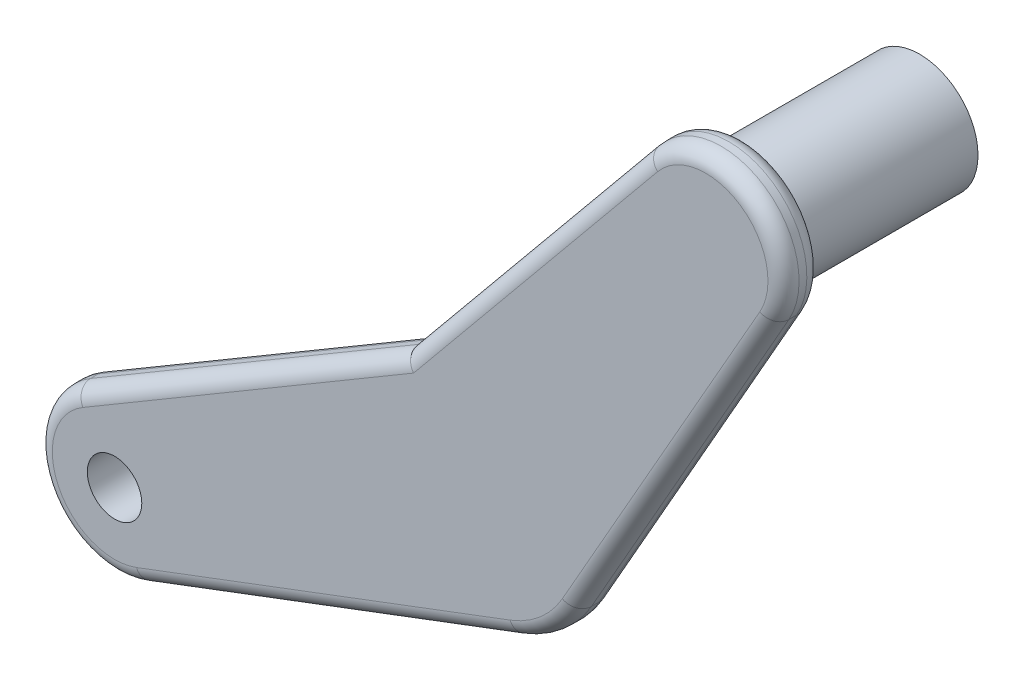
ISO-10303-21;
HEADER;
FILE_DESCRIPTION(('STEP AP214'),'2;1');
FILE_NAME('part.step','',(''),(''),'','','');
FILE_SCHEMA(('AUTOMOTIVE_DESIGN { 1 0 10303 214 1 1 1 1 }'));
ENDSEC;
DATA;
#1=APPLICATION_CONTEXT('core data for automotive mechanical design processes');
#2=APPLICATION_PROTOCOL_DEFINITION('international standard','automotive_design',2000,#1);
#3=PRODUCT_CONTEXT('',#1,'mechanical');
#4=PRODUCT('Part','Part','',(#3));
#5=PRODUCT_RELATED_PRODUCT_CATEGORY('part','',(#4));
#6=PRODUCT_DEFINITION_FORMATION('','',#4);
#7=PRODUCT_DEFINITION_CONTEXT('part definition',#1,'design');
#8=PRODUCT_DEFINITION('design','',#6,#7);
#9=PRODUCT_DEFINITION_SHAPE('','',#8);
#10=(LENGTH_UNIT() NAMED_UNIT(*) SI_UNIT(.MILLI.,.METRE.));
#11=(NAMED_UNIT(*) PLANE_ANGLE_UNIT() SI_UNIT($,.RADIAN.));
#12=(NAMED_UNIT(*) SI_UNIT($,.STERADIAN.) SOLID_ANGLE_UNIT());
#13=UNCERTAINTY_MEASURE_WITH_UNIT(LENGTH_MEASURE(1.E-05),#10,'distance_accuracy_value','');
#14=(GEOMETRIC_REPRESENTATION_CONTEXT(3) GLOBAL_UNCERTAINTY_ASSIGNED_CONTEXT((#13)) GLOBAL_UNIT_ASSIGNED_CONTEXT((#10,
#11,#12)) REPRESENTATION_CONTEXT('',''));
#15=CARTESIAN_POINT('',(0.,0.,0.));
#16=DIRECTION('',(0.,0.,1.));
#17=DIRECTION('',(1.,0.,0.));
#18=AXIS2_PLACEMENT_3D('',#15,#16,#17);
#19=CARTESIAN_POINT('',(-400.,-30.,-290.));
#20=DIRECTION('',(0.,0.,1.));
#21=DIRECTION('',(1.,0.,0.));
#22=AXIS2_PLACEMENT_3D('',#19,#20,#21);
#23=PLANE('',#22);
#24=CARTESIAN_POINT('',(-400.,-30.,-290.));
#25=DIRECTION('',(0.,0.,1.));
#26=DIRECTION('',(1.,0.,0.));
#27=AXIS2_PLACEMENT_3D('',#24,#25,#26);
#28=CIRCLE('',#27,15.);
#29=CARTESIAN_POINT('',(-385.,-30.,-290.));
#30=VERTEX_POINT('',#29);
#31=EDGE_CURVE('E223',#30,#30,#28,.T.);
#32=ORIENTED_EDGE('',*,*,#31,.F.);
#33=EDGE_LOOP('',(#32));
#34=FACE_BOUND('',#33,.T.);
#35=ADVANCED_FACE('F17',(#34),#23,.F.);
#36=CARTESIAN_POINT('',(-400.,-30.,290.));
#37=DIRECTION('',(0.,0.,-1.));
#38=DIRECTION('',(-1.,0.,0.));
#39=AXIS2_PLACEMENT_3D('',#36,#37,#38);
#40=CYLINDRICAL_SURFACE('',#39,15.);
#41=CARTESIAN_POINT('',(-400.,-30.,-245.));
#42=DIRECTION('',(0.,0.,-1.));
#43=DIRECTION('',(-1.,0.,0.));
#44=AXIS2_PLACEMENT_3D('',#41,#42,#43);
#45=CIRCLE('',#44,15.);
#46=CARTESIAN_POINT('',(-415.,-30.,-245.));
#47=VERTEX_POINT('',#46);
#48=EDGE_CURVE('E217',#47,#47,#45,.T.);
#49=ORIENTED_EDGE('',*,*,#48,.T.);
#50=EDGE_LOOP('',(#49));
#51=FACE_BOUND('',#50,.T.);
#52=ORIENTED_EDGE('',*,*,#31,.T.);
#53=EDGE_LOOP('',(#52));
#54=FACE_BOUND('',#53,.T.);
#55=ADVANCED_FACE('F318',(#51,#54),#40,.T.);
#56=CARTESIAN_POINT('',(-400.,-30.,-245.));
#57=DIRECTION('',(0.,0.,-1.));
#58=DIRECTION('',(1.,0.,0.));
#59=AXIS2_PLACEMENT_3D('',#56,#57,#58);
#60=PLANE('',#59);
#61=DIRECTION('',(-0.861260414984514,-0.508163849147795,0.));
#62=VECTOR('',#61,1.);
#63=CARTESIAN_POINT('',(-390.482276314219,-46.1310936719928,-245.));
#64=LINE('',#63,#62);
#65=CARTESIAN_POINT('',(-560.117463122071,-146.219833360248,-245.));
#66=VERTEX_POINT('',#65);
#67=CARTESIAN_POINT('',(-475.092603785415,-96.0531717535579,-245.));
#68=VERTEX_POINT('',#67);
#69=EDGE_CURVE('E234',#66,#68,#64,.F.);
#70=ORIENTED_EDGE('',*,*,#69,.T.);
#71=DIRECTION('',(-0.635517784017503,-0.772086229768076,0.));
#72=VECTOR('',#71,1.);
#73=CARTESIAN_POINT('',(-412.353379676289,-19.8317154557199,-245.));
#74=LINE('',#73,#72);
#75=CARTESIAN_POINT('',(-412.353379676289,-19.8317154557199,-245.));
#76=VERTEX_POINT('',#75);
#77=EDGE_CURVE('E246',#68,#76,#74,.F.);
#78=ORIENTED_EDGE('',*,*,#77,.T.);
#79=CARTESIAN_POINT('',(-400.,-30.,-245.));
#80=DIRECTION('',(0.,0.,-1.));
#81=DIRECTION('',(-1.,0.,0.));
#82=AXIS2_PLACEMENT_3D('',#79,#80,#81);
#83=CIRCLE('',#82,16.);
#84=CARTESIAN_POINT('',(-386.091862031842,-37.9097217560852,-245.));
#85=VERTEX_POINT('',#84);
#86=EDGE_CURVE('E244',#76,#85,#83,.T.);
#87=ORIENTED_EDGE('',*,*,#86,.T.);
#88=DIRECTION('',(0.494357609755329,0.86925862300986,0.));
#89=VECTOR('',#88,1.);
#90=CARTESIAN_POINT('',(-386.091862031842,-37.9097217560851,-245.));
#91=LINE('',#90,#89);
#92=CARTESIAN_POINT('',(-436.861291057363,-127.180652545565,-245.));
#93=VERTEX_POINT('',#92);
#94=EDGE_CURVE('E242',#85,#93,#91,.F.);
#95=ORIENTED_EDGE('',*,*,#94,.T.);
#96=CARTESIAN_POINT('',(-459.462015255619,-114.327354691927,-245.));
#97=DIRECTION('',(0.,0.,-1.));
#98=DIRECTION('',(-1.,0.,0.));
#99=AXIS2_PLACEMENT_3D('',#96,#97,#98);
#100=CIRCLE('',#99,26.);
#101=CARTESIAN_POINT('',(-450.26716856975,-138.647198326772,-245.));
#102=VERTEX_POINT('',#101);
#103=EDGE_CURVE('E240',#93,#102,#100,.T.);
#104=ORIENTED_EDGE('',*,*,#103,.T.);
#105=DIRECTION('',(0.935378601340226,0.353647949456522,0.));
#106=VECTOR('',#105,1.);
#107=CARTESIAN_POINT('',(-370.346837525421,-108.430918893807,-245.));
#108=LINE('',#107,#106);
#109=CARTESIAN_POINT('',(-546.328474344402,-174.966057621444,-245.));
#110=VERTEX_POINT('',#109);
#111=EDGE_CURVE('E238',#102,#110,#108,.F.);
#112=ORIENTED_EDGE('',*,*,#111,.T.);
#113=CARTESIAN_POINT('',(-551.986841535707,-160.,-245.));
#114=DIRECTION('',(0.,0.,-1.));
#115=DIRECTION('',(-1.,0.,0.));
#116=AXIS2_PLACEMENT_3D('',#113,#114,#115);
#117=CIRCLE('',#116,16.);
#118=EDGE_CURVE('E236',#110,#66,#117,.T.);
#119=ORIENTED_EDGE('',*,*,#118,.T.);
#120=EDGE_LOOP('',(#70,#78,#87,#95,#104,#112,#119));
#121=FACE_BOUND('',#120,.T.);
#122=ORIENTED_EDGE('',*,*,#48,.F.);
#123=EDGE_LOOP('',(#122));
#124=FACE_BOUND('',#123,.T.);
#125=CARTESIAN_POINT('',(-551.986841535707,-160.,-245.));
#126=DIRECTION('',(0.,0.,1.));
#127=DIRECTION('',(1.,0.,0.));
#128=AXIS2_PLACEMENT_3D('',#125,#126,#127);
#129=CIRCLE('',#128,7.);
#130=CARTESIAN_POINT('',(-544.986841535707,-160.,-245.));
#131=VERTEX_POINT('',#130);
#132=EDGE_CURVE('E201',#131,#131,#129,.T.);
#133=ORIENTED_EDGE('',*,*,#132,.T.);
#134=EDGE_LOOP('',(#133));
#135=FACE_BOUND('',#134,.T.);
#136=ADVANCED_FACE('F324',(#121,#124,#135),#60,.T.);
#137=CARTESIAN_POINT('',(-382.614827539803,-39.8871521951065,-235.));
#138=DIRECTION('',(0.86925862300986,-0.494357609755329,0.));
#139=DIRECTION('',(0.494357609755329,0.86925862300986,0.));
#140=AXIS2_PLACEMENT_3D('',#137,#138,#139);
#141=PLANE('',#140);
#142=DIRECTION('',(0.,0.,-1.));
#143=VECTOR('',#142,1.);
#144=CARTESIAN_POINT('',(-433.384256565324,-129.158082984586,-235.));
#145=LINE('',#144,#143);
#146=CARTESIAN_POINT('',(-433.384256565324,-129.158082984586,-239.));
#147=VERTEX_POINT('',#146);
#148=CARTESIAN_POINT('',(-433.384256565324,-129.158082984586,-241.));
#149=VERTEX_POINT('',#148);
#150=EDGE_CURVE('E226',#147,#149,#145,.T.);
#151=ORIENTED_EDGE('',*,*,#150,.T.);
#152=DIRECTION('',(0.494357609755329,0.86925862300986,0.));
#153=VECTOR('',#152,1.);
#154=CARTESIAN_POINT('',(-382.614827539803,-39.8871521951065,-241.));
#155=LINE('',#154,#153);
#156=CARTESIAN_POINT('',(-382.614827539803,-39.8871521951065,-241.));
#157=VERTEX_POINT('',#156);
#158=EDGE_CURVE('E255',#149,#157,#155,.T.);
#159=ORIENTED_EDGE('',*,*,#158,.T.);
#160=DIRECTION('',(0.,0.,-1.));
#161=VECTOR('',#160,1.);
#162=CARTESIAN_POINT('',(-382.614827539803,-39.8871521951065,-235.));
#163=LINE('',#162,#161);
#164=CARTESIAN_POINT('',(-382.614827539803,-39.8871521951065,-239.));
#165=VERTEX_POINT('',#164);
#166=EDGE_CURVE('E214',#165,#157,#163,.T.);
#167=ORIENTED_EDGE('',*,*,#166,.F.);
#168=DIRECTION('',(0.494357609755329,0.86925862300986,0.));
#169=VECTOR('',#168,1.);
#170=CARTESIAN_POINT('',(-433.384256565324,-129.158082984587,-239.));
#171=LINE('',#170,#169);
#172=EDGE_CURVE('E253',#165,#147,#171,.F.);
#173=ORIENTED_EDGE('',*,*,#172,.T.);
#174=EDGE_LOOP('',(#151,#159,#167,#173));
#175=FACE_BOUND('',#174,.T.);
#176=ADVANCED_FACE('F297',(#175),#141,.T.);
#177=CARTESIAN_POINT('',(-438.732712976318,-138.562594543234,-235.));
#178=DIRECTION('',(0.353647949456522,-0.935378601340226,0.));
#179=DIRECTION('',(0.935378601340226,0.353647949456522,0.));
#180=AXIS2_PLACEMENT_3D('',#177,#178,#179);
#181=PLANE('',#180);
#182=DIRECTION('',(0.,0.,-1.));
#183=VECTOR('',#182,1.);
#184=CARTESIAN_POINT('',(-544.913882546576,-178.707572026805,-235.));
#185=LINE('',#184,#183);
#186=CARTESIAN_POINT('',(-544.913882546576,-178.707572026805,-239.));
#187=VERTEX_POINT('',#186);
#188=CARTESIAN_POINT('',(-544.913882546576,-178.707572026805,-241.));
#189=VERTEX_POINT('',#188);
#190=EDGE_CURVE('E218',#187,#189,#185,.T.);
#191=ORIENTED_EDGE('',*,*,#190,.T.);
#192=DIRECTION('',(0.935378601340226,0.353647949456522,0.));
#193=VECTOR('',#192,1.);
#194=CARTESIAN_POINT('',(-438.732712976318,-138.562594543234,-241.));
#195=LINE('',#194,#193);
#196=CARTESIAN_POINT('',(-448.852576771924,-142.388712732133,-241.));
#197=VERTEX_POINT('',#196);
#198=EDGE_CURVE('E263',#189,#197,#195,.T.);
#199=ORIENTED_EDGE('',*,*,#198,.T.);
#200=DIRECTION('',(0.,0.,-1.));
#201=VECTOR('',#200,1.);
#202=CARTESIAN_POINT('',(-448.852576771924,-142.388712732133,-235.));
#203=LINE('',#202,#201);
#204=CARTESIAN_POINT('',(-448.852576771924,-142.388712732133,-239.));
#205=VERTEX_POINT('',#204);
#206=EDGE_CURVE('E150',#197,#205,#203,.F.);
#207=ORIENTED_EDGE('',*,*,#206,.T.);
#208=DIRECTION('',(0.935378601340226,0.353647949456522,0.));
#209=VECTOR('',#208,1.);
#210=CARTESIAN_POINT('',(-544.913882546576,-178.707572026805,-239.));
#211=LINE('',#210,#209);
#212=EDGE_CURVE('E261',#205,#187,#211,.F.);
#213=ORIENTED_EDGE('',*,*,#212,.T.);
#214=EDGE_LOOP('',(#191,#199,#207,#213));
#215=FACE_BOUND('',#214,.T.);
#216=ADVANCED_FACE('F359',(#215),#181,.T.);
#217=CARTESIAN_POINT('',(-551.986841535707,-160.,-235.));
#218=DIRECTION('',(0.,0.,-1.));
#219=DIRECTION('',(1.,0.,0.));
#220=AXIS2_PLACEMENT_3D('',#217,#218,#219);
#221=CYLINDRICAL_SURFACE('',#220,20.);
#222=DIRECTION('',(0.,0.,-1.));
#223=VECTOR('',#222,1.);
#224=CARTESIAN_POINT('',(-562.150118518663,-142.77479170031,-235.));
#225=LINE('',#224,#223);
#226=CARTESIAN_POINT('',(-562.150118518663,-142.77479170031,-239.));
#227=VERTEX_POINT('',#226);
#228=CARTESIAN_POINT('',(-562.150118518663,-142.77479170031,-241.));
#229=VERTEX_POINT('',#228);
#230=EDGE_CURVE('E124',#227,#229,#225,.T.);
#231=ORIENTED_EDGE('',*,*,#230,.T.);
#232=CARTESIAN_POINT('',(-551.986841535707,-160.,-241.));
#233=DIRECTION('',(0.,0.,-1.));
#234=DIRECTION('',(-1.,0.,0.));
#235=AXIS2_PLACEMENT_3D('',#232,#233,#234);
#236=CIRCLE('',#235,20.);
#237=EDGE_CURVE('E267',#229,#189,#236,.F.);
#238=ORIENTED_EDGE('',*,*,#237,.T.);
#239=ORIENTED_EDGE('',*,*,#190,.F.);
#240=CARTESIAN_POINT('',(-551.986841535707,-160.,-239.));
#241=DIRECTION('',(0.,0.,-1.));
#242=DIRECTION('',(-1.,0.,0.));
#243=AXIS2_PLACEMENT_3D('',#240,#241,#242);
#244=CIRCLE('',#243,20.);
#245=EDGE_CURVE('E265',#187,#227,#244,.T.);
#246=ORIENTED_EDGE('',*,*,#245,.T.);
#247=EDGE_LOOP('',(#231,#238,#239,#246));
#248=FACE_BOUND('',#247,.T.);
#249=ADVANCED_FACE('F354',(#248),#221,.T.);
#250=CARTESIAN_POINT('',(-562.150118518663,-142.77479170031,-235.));
#251=DIRECTION('',(-0.508163849147795,0.861260414984514,0.));
#252=DIRECTION('',(-0.861260414984514,-0.508163849147795,0.));
#253=AXIS2_PLACEMENT_3D('',#250,#251,#252);
#254=PLANE('',#253);
#255=DIRECTION('',(0.,0.,-1.));
#256=VECTOR('',#255,1.);
#257=CARTESIAN_POINT('',(-477.732712976318,-92.9665420825216,-235.));
#258=LINE('',#257,#256);
#259=CARTESIAN_POINT('',(-477.732712976318,-92.9665420825216,-239.));
#260=VERTEX_POINT('',#259);
#261=CARTESIAN_POINT('',(-477.732712976318,-92.9665420825216,-241.));
#262=VERTEX_POINT('',#261);
#263=EDGE_CURVE('E122',#260,#262,#258,.T.);
#264=ORIENTED_EDGE('',*,*,#263,.T.);
#265=DIRECTION('',(-0.861260414984514,-0.508163849147795,0.));
#266=VECTOR('',#265,1.);
#267=CARTESIAN_POINT('',(-562.150118518663,-142.77479170031,-241.));
#268=LINE('',#267,#266);
#269=EDGE_CURVE('E11',#262,#229,#268,.T.);
#270=ORIENTED_EDGE('',*,*,#269,.T.);
#271=ORIENTED_EDGE('',*,*,#230,.F.);
#272=DIRECTION('',(-0.861260414984514,-0.508163849147795,0.));
#273=VECTOR('',#272,1.);
#274=CARTESIAN_POINT('',(-477.732712976318,-92.9665420825216,-239.));
#275=LINE('',#274,#273);
#276=EDGE_CURVE('E26',#227,#260,#275,.F.);
#277=ORIENTED_EDGE('',*,*,#276,.T.);
#278=EDGE_LOOP('',(#264,#270,#271,#277));
#279=FACE_BOUND('',#278,.T.);
#280=ADVANCED_FACE('F121',(#279),#254,.T.);
#281=CARTESIAN_POINT('',(-477.732712976318,-92.9665420825216,-235.));
#282=DIRECTION('',(-0.772086229768076,0.635517784017503,0.));
#283=DIRECTION('',(-0.635517784017503,-0.772086229768076,0.));
#284=AXIS2_PLACEMENT_3D('',#281,#282,#283);
#285=PLANE('',#284);
#286=DIRECTION('',(0.,0.,-1.));
#287=VECTOR('',#286,1.);
#288=CARTESIAN_POINT('',(-415.441724595362,-17.2896443196499,-235.));
#289=LINE('',#288,#287);
#290=CARTESIAN_POINT('',(-415.441724595362,-17.2896443196499,-239.));
#291=VERTEX_POINT('',#290);
#292=CARTESIAN_POINT('',(-415.441724595362,-17.2896443196499,-241.));
#293=VERTEX_POINT('',#292);
#294=EDGE_CURVE('E141',#291,#293,#289,.T.);
#295=ORIENTED_EDGE('',*,*,#294,.T.);
#296=DIRECTION('',(-0.635517784017503,-0.772086229768076,0.));
#297=VECTOR('',#296,1.);
#298=CARTESIAN_POINT('',(-477.732712976318,-92.9665420825216,-241.));
#299=LINE('',#298,#297);
#300=EDGE_CURVE('E140',#293,#262,#299,.T.);
#301=ORIENTED_EDGE('',*,*,#300,.T.);
#302=ORIENTED_EDGE('',*,*,#263,.F.);
#303=DIRECTION('',(-0.635517784017503,-0.772086229768076,0.));
#304=VECTOR('',#303,1.);
#305=CARTESIAN_POINT('',(-415.441724595362,-17.2896443196499,-239.));
#306=LINE('',#305,#304);
#307=EDGE_CURVE('E137',#260,#291,#306,.F.);
#308=ORIENTED_EDGE('',*,*,#307,.T.);
#309=EDGE_LOOP('',(#295,#301,#302,#308));
#310=FACE_BOUND('',#309,.T.);
#311=ADVANCED_FACE('F136',(#310),#285,.T.);
#312=CARTESIAN_POINT('',(-400.,-30.,-235.));
#313=DIRECTION('',(0.,0.,-1.));
#314=DIRECTION('',(1.,0.,0.));
#315=AXIS2_PLACEMENT_3D('',#312,#313,#314);
#316=CYLINDRICAL_SURFACE('',#315,20.);
#317=ORIENTED_EDGE('',*,*,#166,.T.);
#318=CARTESIAN_POINT('',(-400.,-30.,-241.));
#319=DIRECTION('',(0.,0.,-1.));
#320=DIRECTION('',(-1.,0.,0.));
#321=AXIS2_PLACEMENT_3D('',#318,#319,#320);
#322=CIRCLE('',#321,20.);
#323=EDGE_CURVE('E251',#157,#293,#322,.F.);
#324=ORIENTED_EDGE('',*,*,#323,.T.);
#325=ORIENTED_EDGE('',*,*,#294,.F.);
#326=CARTESIAN_POINT('',(-400.,-30.,-239.));
#327=DIRECTION('',(0.,0.,-1.));
#328=DIRECTION('',(-1.,0.,0.));
#329=AXIS2_PLACEMENT_3D('',#326,#327,#328);
#330=CIRCLE('',#329,20.);
#331=EDGE_CURVE('E249',#291,#165,#330,.T.);
#332=ORIENTED_EDGE('',*,*,#331,.T.);
#333=EDGE_LOOP('',(#317,#324,#325,#332));
#334=FACE_BOUND('',#333,.T.);
#335=ADVANCED_FACE('F294',(#334),#316,.T.);
#336=CARTESIAN_POINT('',(-551.986841535707,-160.,-235.));
#337=DIRECTION('',(0.,0.,-1.));
#338=DIRECTION('',(1.,0.,0.));
#339=AXIS2_PLACEMENT_3D('',#336,#337,#338);
#340=CYLINDRICAL_SURFACE('',#339,7.);
#341=CARTESIAN_POINT('',(-551.986841535707,-160.,-235.));
#342=DIRECTION('',(0.,0.,1.));
#343=DIRECTION('',(1.,0.,0.));
#344=AXIS2_PLACEMENT_3D('',#341,#342,#343);
#345=CIRCLE('',#344,7.);
#346=CARTESIAN_POINT('',(-544.986841535707,-160.,-235.));
#347=VERTEX_POINT('',#346);
#348=EDGE_CURVE('E207',#347,#347,#345,.T.);
#349=ORIENTED_EDGE('',*,*,#348,.T.);
#350=EDGE_LOOP('',(#349));
#351=FACE_BOUND('',#350,.T.);
#352=ORIENTED_EDGE('',*,*,#132,.F.);
#353=EDGE_LOOP('',(#352));
#354=FACE_BOUND('',#353,.T.);
#355=ADVANCED_FACE('F341',(#351,#354),#340,.F.);
#356=CARTESIAN_POINT('',(-400.,-30.,-235.));
#357=DIRECTION('',(0.,0.,-1.));
#358=DIRECTION('',(1.,0.,0.));
#359=AXIS2_PLACEMENT_3D('',#356,#357,#358);
#360=PLANE('',#359);
#361=CARTESIAN_POINT('',(-400.,-30.,-235.));
#362=DIRECTION('',(0.,0.,-1.));
#363=DIRECTION('',(-1.,0.,0.));
#364=AXIS2_PLACEMENT_3D('',#361,#362,#363);
#365=CIRCLE('',#364,16.);
#366=CARTESIAN_POINT('',(-386.091862031842,-37.9097217560852,-235.));
#367=VERTEX_POINT('',#366);
#368=CARTESIAN_POINT('',(-412.353379676289,-19.8317154557199,-235.));
#369=VERTEX_POINT('',#368);
#370=EDGE_CURVE('E34',#367,#369,#365,.F.);
#371=ORIENTED_EDGE('',*,*,#370,.T.);
#372=DIRECTION('',(-0.635517784017503,-0.772086229768076,0.));
#373=VECTOR('',#372,1.);
#374=CARTESIAN_POINT('',(-474.644368057245,-95.5086132185916,-235.));
#375=LINE('',#374,#373);
#376=CARTESIAN_POINT('',(-475.092603785415,-96.053171753558,-235.));
#377=VERTEX_POINT('',#376);
#378=EDGE_CURVE('E129',#369,#377,#375,.T.);
#379=ORIENTED_EDGE('',*,*,#378,.T.);
#380=DIRECTION('',(-0.861260414984514,-0.508163849147795,0.));
#381=VECTOR('',#380,1.);
#382=CARTESIAN_POINT('',(-560.117463122071,-146.219833360248,-235.));
#383=LINE('',#382,#381);
#384=CARTESIAN_POINT('',(-560.117463122071,-146.219833360248,-235.));
#385=VERTEX_POINT('',#384);
#386=EDGE_CURVE('E153',#377,#385,#383,.T.);
#387=ORIENTED_EDGE('',*,*,#386,.T.);
#388=CARTESIAN_POINT('',(-551.986841535707,-160.,-235.));
#389=DIRECTION('',(0.,0.,-1.));
#390=DIRECTION('',(-1.,0.,0.));
#391=AXIS2_PLACEMENT_3D('',#388,#389,#390);
#392=CIRCLE('',#391,16.);
#393=CARTESIAN_POINT('',(-546.328474344402,-174.966057621444,-235.));
#394=VERTEX_POINT('',#393);
#395=EDGE_CURVE('E270',#385,#394,#392,.F.);
#396=ORIENTED_EDGE('',*,*,#395,.T.);
#397=DIRECTION('',(0.935378601340226,0.353647949456522,0.));
#398=VECTOR('',#397,1.);
#399=CARTESIAN_POINT('',(-450.26716856975,-138.647198326773,-235.));
#400=LINE('',#399,#398);
#401=CARTESIAN_POINT('',(-450.26716856975,-138.647198326773,-235.));
#402=VERTEX_POINT('',#401);
#403=EDGE_CURVE('E272',#394,#402,#400,.T.);
#404=ORIENTED_EDGE('',*,*,#403,.T.);
#405=CARTESIAN_POINT('',(-459.462015255619,-114.327354691927,-235.));
#406=DIRECTION('',(0.,0.,-1.));
#407=DIRECTION('',(-1.,0.,0.));
#408=AXIS2_PLACEMENT_3D('',#405,#406,#407);
#409=CIRCLE('',#408,26.);
#410=CARTESIAN_POINT('',(-436.861291057363,-127.180652545565,-235.));
#411=VERTEX_POINT('',#410);
#412=EDGE_CURVE('E274',#402,#411,#409,.F.);
#413=ORIENTED_EDGE('',*,*,#412,.T.);
#414=DIRECTION('',(0.494357609755329,0.86925862300986,0.));
#415=VECTOR('',#414,1.);
#416=CARTESIAN_POINT('',(-386.091862031842,-37.9097217560852,-235.));
#417=LINE('',#416,#415);
#418=EDGE_CURVE('E39',#411,#367,#417,.T.);
#419=ORIENTED_EDGE('',*,*,#418,.T.);
#420=EDGE_LOOP('',(#371,#379,#387,#396,#404,#413,#419));
#421=FACE_BOUND('',#420,.T.);
#422=ORIENTED_EDGE('',*,*,#348,.F.);
#423=EDGE_LOOP('',(#422));
#424=FACE_BOUND('',#423,.T.);
#425=ADVANCED_FACE('F278',(#421,#424),#360,.F.);
#426=CARTESIAN_POINT('',(-459.462015255619,-114.327354691927,-235.));
#427=DIRECTION('',(0.,0.,-1.));
#428=DIRECTION('',(-1.,0.,0.));
#429=AXIS2_PLACEMENT_3D('',#426,#427,#428);
#430=CYLINDRICAL_SURFACE('',#429,30.);
#431=ORIENTED_EDGE('',*,*,#206,.F.);
#432=CARTESIAN_POINT('',(-459.462015255619,-114.327354691927,-241.));
#433=DIRECTION('',(0.,0.,-1.));
#434=DIRECTION('',(-1.,0.,0.));
#435=AXIS2_PLACEMENT_3D('',#432,#433,#434);
#436=CIRCLE('',#435,30.);
#437=EDGE_CURVE('E259',#197,#149,#436,.F.);
#438=ORIENTED_EDGE('',*,*,#437,.T.);
#439=ORIENTED_EDGE('',*,*,#150,.F.);
#440=CARTESIAN_POINT('',(-459.462015255619,-114.327354691927,-239.));
#441=DIRECTION('',(0.,0.,-1.));
#442=DIRECTION('',(-1.,0.,0.));
#443=AXIS2_PLACEMENT_3D('',#440,#441,#442);
#444=CIRCLE('',#443,30.);
#445=EDGE_CURVE('E257',#147,#205,#444,.T.);
#446=ORIENTED_EDGE('',*,*,#445,.T.);
#447=EDGE_LOOP('',(#431,#438,#439,#446));
#448=FACE_BOUND('',#447,.T.);
#449=ADVANCED_FACE('F330',(#448),#430,.T.);
#450=CARTESIAN_POINT('',(-459.462015255619,-114.327354691927,-241.));
#451=DIRECTION('',(0.,0.,-1.));
#452=DIRECTION('',(-1.,0.,0.));
#453=AXIS2_PLACEMENT_3D('',#450,#451,#452);
#454=TOROIDAL_SURFACE('',#453,26.,4.);
#455=CARTESIAN_POINT('',(-436.861291057363,-127.180652545565,-241.));
#456=DIRECTION('',(0.494357609755328,0.86925862300986,0.));
#457=DIRECTION('',(-0.86925862300986,0.494357609755328,0.));
#458=AXIS2_PLACEMENT_3D('',#455,#456,#457);
#459=CIRCLE('',#458,4.);
#460=EDGE_CURVE('E194',#149,#93,#459,.T.);
#461=ORIENTED_EDGE('',*,*,#460,.F.);
#462=ORIENTED_EDGE('',*,*,#437,.F.);
#463=CARTESIAN_POINT('',(-450.26716856975,-138.647198326773,-241.));
#464=DIRECTION('',(-0.935378601340224,-0.353647949456527,0.));
#465=DIRECTION('',(0.353647949456527,-0.935378601340224,0.));
#466=AXIS2_PLACEMENT_3D('',#463,#464,#465);
#467=CIRCLE('',#466,4.);
#468=EDGE_CURVE('E158',#102,#197,#467,.T.);
#469=ORIENTED_EDGE('',*,*,#468,.F.);
#470=ORIENTED_EDGE('',*,*,#103,.F.);
#471=EDGE_LOOP('',(#461,#462,#469,#470));
#472=FACE_BOUND('',#471,.T.);
#473=ADVANCED_FACE('F332',(#472),#454,.T.);
#474=CARTESIAN_POINT('',(-440.147304774144,-134.821080137873,-241.));
#475=DIRECTION('',(0.935378601340226,0.353647949456522,0.));
#476=DIRECTION('',(-0.353647949456522,0.935378601340226,0.));
#477=AXIS2_PLACEMENT_3D('',#474,#475,#476);
#478=CYLINDRICAL_SURFACE('',#477,4.);
#479=ORIENTED_EDGE('',*,*,#468,.T.);
#480=ORIENTED_EDGE('',*,*,#198,.F.);
#481=CARTESIAN_POINT('',(-546.328474344402,-174.966057621444,-241.));
#482=DIRECTION('',(-0.935378601340225,-0.353647949456525,0.));
#483=DIRECTION('',(0.353647949456525,-0.935378601340225,0.));
#484=AXIS2_PLACEMENT_3D('',#481,#482,#483);
#485=CIRCLE('',#484,4.);
#486=EDGE_CURVE('E192',#110,#189,#485,.T.);
#487=ORIENTED_EDGE('',*,*,#486,.F.);
#488=ORIENTED_EDGE('',*,*,#111,.F.);
#489=EDGE_LOOP('',(#479,#480,#487,#488));
#490=FACE_BOUND('',#489,.T.);
#491=ADVANCED_FACE('F338',(#490),#478,.T.);
#492=CARTESIAN_POINT('',(-386.091862031842,-37.9097217560852,-241.));
#493=DIRECTION('',(0.494357609755329,0.86925862300986,0.));
#494=DIRECTION('',(-0.86925862300986,0.494357609755329,0.));
#495=AXIS2_PLACEMENT_3D('',#492,#493,#494);
#496=CYLINDRICAL_SURFACE('',#495,4.);
#497=ORIENTED_EDGE('',*,*,#460,.T.);
#498=ORIENTED_EDGE('',*,*,#94,.F.);
#499=CARTESIAN_POINT('',(-386.091862031842,-37.9097217560852,-241.));
#500=DIRECTION('',(0.494357609755327,0.869258623009861,0.));
#501=DIRECTION('',(-0.869258623009861,0.494357609755327,0.));
#502=AXIS2_PLACEMENT_3D('',#499,#500,#501);
#503=CIRCLE('',#502,4.);
#504=EDGE_CURVE('E189',#157,#85,#503,.T.);
#505=ORIENTED_EDGE('',*,*,#504,.F.);
#506=ORIENTED_EDGE('',*,*,#158,.F.);
#507=EDGE_LOOP('',(#497,#498,#505,#506));
#508=FACE_BOUND('',#507,.T.);
#509=ADVANCED_FACE('F299',(#508),#496,.T.);
#510=CARTESIAN_POINT('',(-551.986841535707,-160.,-241.));
#511=DIRECTION('',(0.,0.,-1.));
#512=DIRECTION('',(-1.,0.,0.));
#513=AXIS2_PLACEMENT_3D('',#510,#511,#512);
#514=TOROIDAL_SURFACE('',#513,16.,4.);
#515=ORIENTED_EDGE('',*,*,#486,.T.);
#516=ORIENTED_EDGE('',*,*,#237,.F.);
#517=CARTESIAN_POINT('',(-560.117463122071,-146.219833360248,-241.));
#518=DIRECTION('',(0.86126041498452,0.508163849147785,0.));
#519=DIRECTION('',(-0.508163849147785,0.86126041498452,0.));
#520=AXIS2_PLACEMENT_3D('',#517,#518,#519);
#521=CIRCLE('',#520,4.);
#522=EDGE_CURVE('E184',#66,#229,#521,.T.);
#523=ORIENTED_EDGE('',*,*,#522,.F.);
#524=ORIENTED_EDGE('',*,*,#118,.F.);
#525=EDGE_LOOP('',(#515,#516,#523,#524));
#526=FACE_BOUND('',#525,.T.);
#527=ADVANCED_FACE('F357',(#526),#514,.T.);
#528=CARTESIAN_POINT('',(-400.,-30.,-241.));
#529=DIRECTION('',(0.,0.,-1.));
#530=DIRECTION('',(-1.,0.,0.));
#531=AXIS2_PLACEMENT_3D('',#528,#529,#530);
#532=TOROIDAL_SURFACE('',#531,16.,4.);
#533=ORIENTED_EDGE('',*,*,#504,.T.);
#534=ORIENTED_EDGE('',*,*,#86,.F.);
#535=CARTESIAN_POINT('',(-412.353379676289,-19.8317154557199,-241.));
#536=DIRECTION('',(-0.635517784017506,-0.772086229768074,0.));
#537=DIRECTION('',(0.772086229768074,-0.635517784017506,0.));
#538=AXIS2_PLACEMENT_3D('',#535,#536,#537);
#539=CIRCLE('',#538,4.);
#540=EDGE_CURVE('E178',#293,#76,#539,.T.);
#541=ORIENTED_EDGE('',*,*,#540,.F.);
#542=ORIENTED_EDGE('',*,*,#323,.F.);
#543=EDGE_LOOP('',(#533,#534,#541,#542));
#544=FACE_BOUND('',#543,.T.);
#545=ADVANCED_FACE('F304',(#544),#532,.T.);
#546=CARTESIAN_POINT('',(-560.117463122071,-146.219833360248,-241.));
#547=DIRECTION('',(-0.861260414984514,-0.508163849147795,0.));
#548=DIRECTION('',(0.508163849147795,-0.861260414984514,0.));
#549=AXIS2_PLACEMENT_3D('',#546,#547,#548);
#550=CYLINDRICAL_SURFACE('',#549,4.);
#551=ORIENTED_EDGE('',*,*,#522,.T.);
#552=ORIENTED_EDGE('',*,*,#269,.F.);
#553=CARTESIAN_POINT('',(-475.092603785415,-96.0531717535578,-241.));
#554=DIRECTION('',(-0.759934207678533,-0.65,0.));
#555=DIRECTION('',(0.65,-0.759934207678533,0.));
#556=AXIS2_PLACEMENT_3D('',#553,#554,#555);
#557=ELLIPSE('',#556,4.06170644754298,4.);
#558=EDGE_CURVE('E173',#68,#262,#557,.F.);
#559=ORIENTED_EDGE('',*,*,#558,.F.);
#560=ORIENTED_EDGE('',*,*,#69,.F.);
#561=EDGE_LOOP('',(#551,#552,#559,#560));
#562=FACE_BOUND('',#561,.T.);
#563=ADVANCED_FACE('F307',(#562),#550,.T.);
#564=CARTESIAN_POINT('',(-474.644368057245,-95.5086132185916,-241.));
#565=DIRECTION('',(-0.635517784017503,-0.772086229768076,0.));
#566=DIRECTION('',(0.772086229768076,-0.635517784017503,0.));
#567=AXIS2_PLACEMENT_3D('',#564,#565,#566);
#568=CYLINDRICAL_SURFACE('',#567,4.);
#569=ORIENTED_EDGE('',*,*,#540,.T.);
#570=ORIENTED_EDGE('',*,*,#77,.F.);
#571=ORIENTED_EDGE('',*,*,#558,.T.);
#572=ORIENTED_EDGE('',*,*,#300,.F.);
#573=EDGE_LOOP('',(#569,#570,#571,#572));
#574=FACE_BOUND('',#573,.T.);
#575=ADVANCED_FACE('F305',(#574),#568,.T.);
#576=CARTESIAN_POINT('',(-459.462015255619,-114.327354691927,-239.));
#577=DIRECTION('',(0.,0.,-1.));
#578=DIRECTION('',(-1.,0.,0.));
#579=AXIS2_PLACEMENT_3D('',#576,#577,#578);
#580=TOROIDAL_SURFACE('',#579,26.,4.);
#581=CARTESIAN_POINT('',(-436.861291057363,-127.180652545565,-239.));
#582=DIRECTION('',(0.494357609755329,0.86925862300986,0.));
#583=DIRECTION('',(-0.86925862300986,0.494357609755329,0.));
#584=AXIS2_PLACEMENT_3D('',#581,#582,#583);
#585=CIRCLE('',#584,4.);
#586=EDGE_CURVE('E167',#411,#147,#585,.T.);
#587=ORIENTED_EDGE('',*,*,#586,.F.);
#588=ORIENTED_EDGE('',*,*,#412,.F.);
#589=CARTESIAN_POINT('',(-450.26716856975,-138.647198326772,-239.));
#590=DIRECTION('',(-0.935378601340225,-0.353647949456525,0.));
#591=DIRECTION('',(0.353647949456525,-0.935378601340225,0.));
#592=AXIS2_PLACEMENT_3D('',#589,#590,#591);
#593=CIRCLE('',#592,4.);
#594=EDGE_CURVE('E21',#205,#402,#593,.T.);
#595=ORIENTED_EDGE('',*,*,#594,.F.);
#596=ORIENTED_EDGE('',*,*,#445,.F.);
#597=EDGE_LOOP('',(#587,#588,#595,#596));
#598=FACE_BOUND('',#597,.T.);
#599=ADVANCED_FACE('F19',(#598),#580,.T.);
#600=CARTESIAN_POINT('',(-370.346837525421,-108.430918893807,-239.));
#601=DIRECTION('',(-0.935378601340226,-0.353647949456522,0.));
#602=DIRECTION('',(0.353647949456522,-0.935378601340226,0.));
#603=AXIS2_PLACEMENT_3D('',#600,#601,#602);
#604=CYLINDRICAL_SURFACE('',#603,4.);
#605=ORIENTED_EDGE('',*,*,#594,.T.);
#606=ORIENTED_EDGE('',*,*,#403,.F.);
#607=CARTESIAN_POINT('',(-546.328474344402,-174.966057621444,-239.));
#608=DIRECTION('',(-0.935378601340225,-0.353647949456525,0.));
#609=DIRECTION('',(0.353647949456525,-0.935378601340225,0.));
#610=AXIS2_PLACEMENT_3D('',#607,#608,#609);
#611=CIRCLE('',#610,4.);
#612=EDGE_CURVE('E165',#187,#394,#611,.T.);
#613=ORIENTED_EDGE('',*,*,#612,.F.);
#614=ORIENTED_EDGE('',*,*,#212,.F.);
#615=EDGE_LOOP('',(#605,#606,#613,#614));
#616=FACE_BOUND('',#615,.T.);
#617=ADVANCED_FACE('F285',(#616),#604,.T.);
#618=CARTESIAN_POINT('',(-386.091862031842,-37.9097217560851,-239.));
#619=DIRECTION('',(-0.494357609755329,-0.86925862300986,0.));
#620=DIRECTION('',(0.86925862300986,-0.494357609755329,0.));
#621=AXIS2_PLACEMENT_3D('',#618,#619,#620);
#622=CYLINDRICAL_SURFACE('',#621,4.);
#623=ORIENTED_EDGE('',*,*,#586,.T.);
#624=ORIENTED_EDGE('',*,*,#172,.F.);
#625=CARTESIAN_POINT('',(-386.091862031842,-37.9097217560852,-239.));
#626=DIRECTION('',(0.494357609755327,0.869258623009861,0.));
#627=DIRECTION('',(-0.869258623009861,0.494357609755327,0.));
#628=AXIS2_PLACEMENT_3D('',#625,#626,#627);
#629=CIRCLE('',#628,4.);
#630=EDGE_CURVE('E162',#367,#165,#629,.T.);
#631=ORIENTED_EDGE('',*,*,#630,.F.);
#632=ORIENTED_EDGE('',*,*,#418,.F.);
#633=EDGE_LOOP('',(#623,#624,#631,#632));
#634=FACE_BOUND('',#633,.T.);
#635=ADVANCED_FACE('F289',(#634),#622,.T.);
#636=CARTESIAN_POINT('',(-551.986841535707,-160.,-239.));
#637=DIRECTION('',(0.,0.,-1.));
#638=DIRECTION('',(-1.,0.,0.));
#639=AXIS2_PLACEMENT_3D('',#636,#637,#638);
#640=TOROIDAL_SURFACE('',#639,16.,4.);
#641=ORIENTED_EDGE('',*,*,#612,.T.);
#642=ORIENTED_EDGE('',*,*,#395,.F.);
#643=CARTESIAN_POINT('',(-560.117463122071,-146.219833360248,-239.));
#644=DIRECTION('',(0.861260414984518,0.508163849147788,0.));
#645=DIRECTION('',(-0.508163849147788,0.861260414984518,0.));
#646=AXIS2_PLACEMENT_3D('',#643,#644,#645);
#647=CIRCLE('',#646,4.);
#648=EDGE_CURVE('E155',#227,#385,#647,.T.);
#649=ORIENTED_EDGE('',*,*,#648,.F.);
#650=ORIENTED_EDGE('',*,*,#245,.F.);
#651=EDGE_LOOP('',(#641,#642,#649,#650));
#652=FACE_BOUND('',#651,.T.);
#653=ADVANCED_FACE('F282',(#652),#640,.T.);
#654=CARTESIAN_POINT('',(-400.,-30.,-239.));
#655=DIRECTION('',(0.,0.,-1.));
#656=DIRECTION('',(-1.,0.,0.));
#657=AXIS2_PLACEMENT_3D('',#654,#655,#656);
#658=TOROIDAL_SURFACE('',#657,16.,4.);
#659=ORIENTED_EDGE('',*,*,#630,.T.);
#660=ORIENTED_EDGE('',*,*,#331,.F.);
#661=CARTESIAN_POINT('',(-412.353379676289,-19.8317154557199,-239.));
#662=DIRECTION('',(-0.635517784017507,-0.772086229768073,0.));
#663=DIRECTION('',(0.772086229768073,-0.635517784017507,0.));
#664=AXIS2_PLACEMENT_3D('',#661,#662,#663);
#665=CIRCLE('',#664,4.);
#666=EDGE_CURVE('E148',#369,#291,#665,.T.);
#667=ORIENTED_EDGE('',*,*,#666,.F.);
#668=ORIENTED_EDGE('',*,*,#370,.F.);
#669=EDGE_LOOP('',(#659,#660,#667,#668));
#670=FACE_BOUND('',#669,.T.);
#671=ADVANCED_FACE('F291',(#670),#658,.T.);
#672=CARTESIAN_POINT('',(-390.482276314219,-46.1310936719928,-239.));
#673=DIRECTION('',(0.861260414984514,0.508163849147795,0.));
#674=DIRECTION('',(-0.508163849147795,0.861260414984514,0.));
#675=AXIS2_PLACEMENT_3D('',#672,#673,#674);
#676=CYLINDRICAL_SURFACE('',#675,4.);
#677=ORIENTED_EDGE('',*,*,#648,.T.);
#678=ORIENTED_EDGE('',*,*,#386,.F.);
#679=CARTESIAN_POINT('',(-475.092603785415,-96.053171753558,-239.));
#680=DIRECTION('',(0.759934207678533,0.65,0.));
#681=DIRECTION('',(-0.65,0.759934207678533,0.));
#682=AXIS2_PLACEMENT_3D('',#679,#680,#681);
#683=ELLIPSE('',#682,4.06170644754298,4.);
#684=EDGE_CURVE('E146',#260,#377,#683,.T.);
#685=ORIENTED_EDGE('',*,*,#684,.F.);
#686=ORIENTED_EDGE('',*,*,#276,.F.);
#687=EDGE_LOOP('',(#677,#678,#685,#686));
#688=FACE_BOUND('',#687,.T.);
#689=ADVANCED_FACE('F152',(#688),#676,.T.);
#690=CARTESIAN_POINT('',(-412.353379676289,-19.8317154557199,-239.));
#691=DIRECTION('',(0.635517784017503,0.772086229768076,0.));
#692=DIRECTION('',(-0.772086229768076,0.635517784017503,0.));
#693=AXIS2_PLACEMENT_3D('',#690,#691,#692);
#694=CYLINDRICAL_SURFACE('',#693,4.);
#695=ORIENTED_EDGE('',*,*,#666,.T.);
#696=ORIENTED_EDGE('',*,*,#307,.F.);
#697=ORIENTED_EDGE('',*,*,#684,.T.);
#698=ORIENTED_EDGE('',*,*,#378,.F.);
#699=EDGE_LOOP('',(#695,#696,#697,#698));
#700=FACE_BOUND('',#699,.T.);
#701=ADVANCED_FACE('F144',(#700),#694,.T.);
#702=CLOSED_SHELL('',(#35,#55,#136,#176,#216,#249,#280,#311,#335,#355,#425,#449,#473,#491,#509,
#527,#545,#563,#575,#599,#617,#635,#653,#671,#689,#701));
#703=MANIFOLD_SOLID_BREP('B1',#702);
#704=ADVANCED_BREP_SHAPE_REPRESENTATION('',(#18,#703),#14);
#705=SHAPE_DEFINITION_REPRESENTATION(#9,#704);
ENDSEC;
END-ISO-10303-21;
